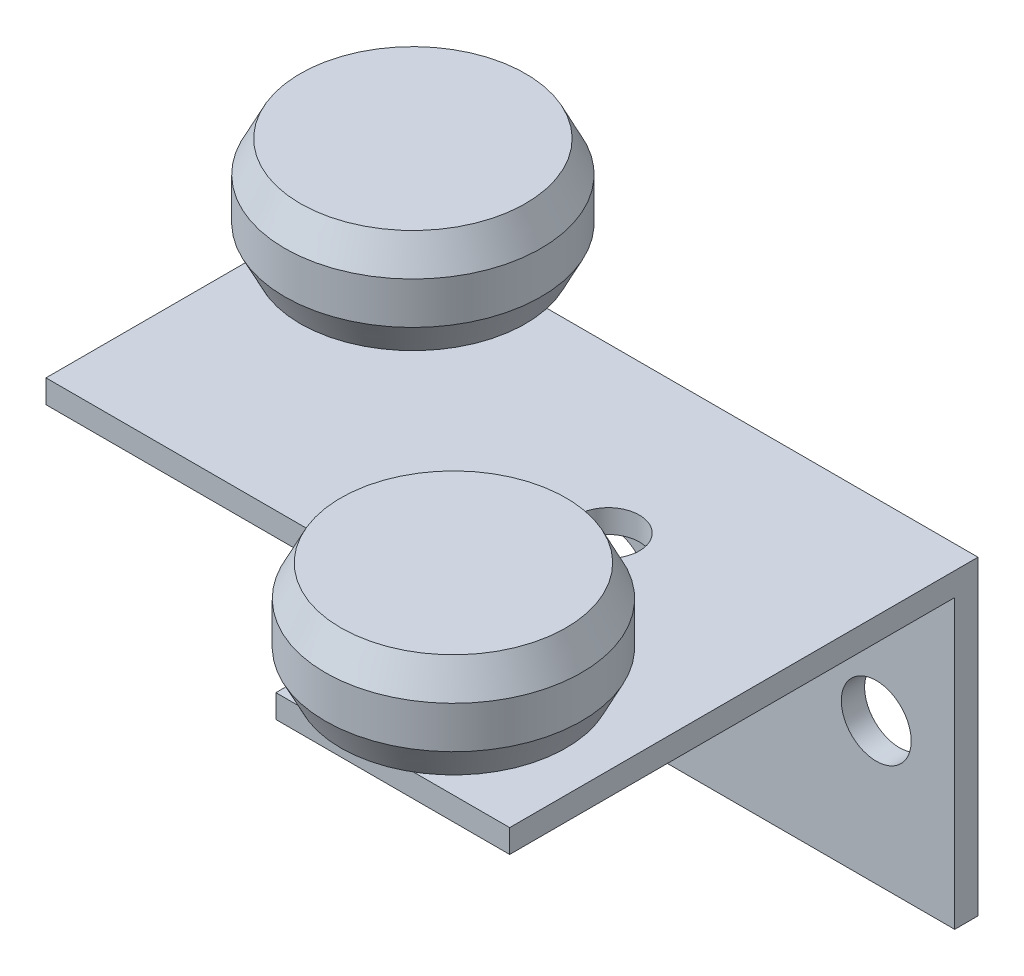
ISO-10303-21;
HEADER;
FILE_DESCRIPTION(('STEP AP214'),'2;1');
FILE_NAME('part.step','',(''),(''),'','','');
FILE_SCHEMA(('AUTOMOTIVE_DESIGN { 1 0 10303 214 1 1 1 1 }'));
ENDSEC;
DATA;
#1=APPLICATION_CONTEXT('core data for automotive mechanical design processes');
#2=APPLICATION_PROTOCOL_DEFINITION('international standard','automotive_design',2000,#1);
#3=PRODUCT_CONTEXT('',#1,'mechanical');
#4=PRODUCT('Part','Part','',(#3));
#5=PRODUCT_RELATED_PRODUCT_CATEGORY('part','',(#4));
#6=PRODUCT_DEFINITION_FORMATION('','',#4);
#7=PRODUCT_DEFINITION_CONTEXT('part definition',#1,'design');
#8=PRODUCT_DEFINITION('design','',#6,#7);
#9=PRODUCT_DEFINITION_SHAPE('','',#8);
#10=(LENGTH_UNIT() NAMED_UNIT(*) SI_UNIT(.MILLI.,.METRE.));
#11=(NAMED_UNIT(*) PLANE_ANGLE_UNIT() SI_UNIT($,.RADIAN.));
#12=(NAMED_UNIT(*) SI_UNIT($,.STERADIAN.) SOLID_ANGLE_UNIT());
#13=UNCERTAINTY_MEASURE_WITH_UNIT(LENGTH_MEASURE(1.E-05),#10,'distance_accuracy_value','');
#14=(GEOMETRIC_REPRESENTATION_CONTEXT(3) GLOBAL_UNCERTAINTY_ASSIGNED_CONTEXT((#13)) GLOBAL_UNIT_ASSIGNED_CONTEXT((#10,
#11,#12)) REPRESENTATION_CONTEXT('',''));
#15=CARTESIAN_POINT('',(0.,0.,0.));
#16=DIRECTION('',(0.,0.,1.));
#17=DIRECTION('',(1.,0.,0.));
#18=AXIS2_PLACEMENT_3D('',#15,#16,#17);
#19=CARTESIAN_POINT('',(-313.663037827401,-412.414988452452,26.25));
#20=DIRECTION('',(0.,-1.,0.));
#21=DIRECTION('',(0.,0.,-1.));
#22=AXIS2_PLACEMENT_3D('',#19,#20,#21);
#23=CYLINDRICAL_SURFACE('',#22,1.69999999999996);
#24=CARTESIAN_POINT('',(-313.663037827401,-421.464988452452,26.25));
#25=DIRECTION('',(0.,-1.,0.));
#26=DIRECTION('',(0.,0.,-1.));
#27=AXIS2_PLACEMENT_3D('',#24,#25,#26);
#28=CIRCLE('',#27,1.69999999999996);
#29=CARTESIAN_POINT('',(-313.663037827401,-421.464988452452,24.55));
#30=VERTEX_POINT('',#29);
#31=EDGE_CURVE('E216',#30,#30,#28,.F.);
#32=ORIENTED_EDGE('',*,*,#31,.T.);
#33=EDGE_LOOP('',(#32));
#34=FACE_BOUND('',#33,.T.);
#35=CARTESIAN_POINT('',(-313.663037827401,-419.114988452452,26.25));
#36=DIRECTION('',(0.,1.,0.));
#37=DIRECTION('',(0.,0.,1.));
#38=AXIS2_PLACEMENT_3D('',#35,#36,#37);
#39=CIRCLE('',#38,1.69999999999996);
#40=CARTESIAN_POINT('',(-313.663037827401,-419.114988452452,27.95));
#41=VERTEX_POINT('',#40);
#42=EDGE_CURVE('E227',#41,#41,#39,.T.);
#43=ORIENTED_EDGE('',*,*,#42,.F.);
#44=EDGE_LOOP('',(#43));
#45=FACE_BOUND('',#44,.T.);
#46=ADVANCED_FACE('F16',(#34,#45),#23,.T.);
#47=CARTESIAN_POINT('',(-338.623037827401,-412.414988452452,3.9));
#48=DIRECTION('',(0.,-1.,0.));
#49=DIRECTION('',(0.,0.,-1.));
#50=AXIS2_PLACEMENT_3D('',#47,#48,#49);
#51=CYLINDRICAL_SURFACE('',#50,1.69999999999996);
#52=CARTESIAN_POINT('',(-338.623037827401,-421.464988452452,3.9));
#53=DIRECTION('',(0.,-1.,0.));
#54=DIRECTION('',(0.,0.,-1.));
#55=AXIS2_PLACEMENT_3D('',#52,#53,#54);
#56=CIRCLE('',#55,1.69999999999996);
#57=CARTESIAN_POINT('',(-338.623037827401,-421.464988452452,2.20000000000004));
#58=VERTEX_POINT('',#57);
#59=EDGE_CURVE('E219',#58,#58,#56,.F.);
#60=ORIENTED_EDGE('',*,*,#59,.T.);
#61=EDGE_LOOP('',(#60));
#62=FACE_BOUND('',#61,.T.);
#63=CARTESIAN_POINT('',(-338.623037827401,-419.114988452452,3.9));
#64=DIRECTION('',(0.,1.,0.));
#65=DIRECTION('',(0.,0.,1.));
#66=AXIS2_PLACEMENT_3D('',#63,#64,#65);
#67=CIRCLE('',#66,1.69999999999996);
#68=CARTESIAN_POINT('',(-338.623037827401,-419.114988452452,5.59999999999996));
#69=VERTEX_POINT('',#68);
#70=EDGE_CURVE('E223',#69,#69,#67,.T.);
#71=ORIENTED_EDGE('',*,*,#70,.F.);
#72=EDGE_LOOP('',(#71));
#73=FACE_BOUND('',#72,.T.);
#74=ADVANCED_FACE('F274',(#62,#73),#51,.T.);
#75=CARTESIAN_POINT('',(-333.243037827401,-421.464988452452,1.5));
#76=DIRECTION('',(0.,-1.,0.));
#77=DIRECTION('',(0.,0.,-1.));
#78=AXIS2_PLACEMENT_3D('',#75,#76,#77);
#79=PLANE('',#78);
#80=ORIENTED_EDGE('',*,*,#31,.F.);
#81=EDGE_LOOP('',(#80));
#82=FACE_BOUND('',#81,.T.);
#83=DIRECTION('',(-1.,0.,0.));
#84=VECTOR('',#83,1.);
#85=CARTESIAN_POINT('',(-333.243037827401,-421.464988452452,0.));
#86=LINE('',#85,#84);
#87=CARTESIAN_POINT('',(-306.143037827401,-421.464988452452,0.));
#88=VERTEX_POINT('',#87);
#89=CARTESIAN_POINT('',(-346.143037827401,-421.464988452452,0.));
#90=VERTEX_POINT('',#89);
#91=EDGE_CURVE('E186',#88,#90,#86,.T.);
#92=ORIENTED_EDGE('',*,*,#91,.T.);
#93=DIRECTION('',(0.,0.,1.));
#94=VECTOR('',#93,1.);
#95=CARTESIAN_POINT('',(-346.143037827401,-421.464988452452,20.));
#96=LINE('',#95,#94);
#97=CARTESIAN_POINT('',(-346.143037827401,-421.464988452452,20.));
#98=VERTEX_POINT('',#97);
#99=EDGE_CURVE('E126',#90,#98,#96,.T.);
#100=ORIENTED_EDGE('',*,*,#99,.T.);
#101=DIRECTION('',(1.,0.,0.));
#102=VECTOR('',#101,1.);
#103=CARTESIAN_POINT('',(-321.193037827401,-421.464988452452,20.));
#104=LINE('',#103,#102);
#105=CARTESIAN_POINT('',(-321.193037827401,-421.464988452452,20.));
#106=VERTEX_POINT('',#105);
#107=EDGE_CURVE('E122',#98,#106,#104,.T.);
#108=ORIENTED_EDGE('',*,*,#107,.T.);
#109=DIRECTION('',(0.,0.,1.));
#110=VECTOR('',#109,1.);
#111=CARTESIAN_POINT('',(-321.193037827401,-421.464988452452,30.15));
#112=LINE('',#111,#110);
#113=CARTESIAN_POINT('',(-321.193037827401,-421.464988452452,30.15));
#114=VERTEX_POINT('',#113);
#115=EDGE_CURVE('E142',#106,#114,#112,.T.);
#116=ORIENTED_EDGE('',*,*,#115,.T.);
#117=DIRECTION('',(1.,0.,0.));
#118=VECTOR('',#117,1.);
#119=CARTESIAN_POINT('',(-306.143037827401,-421.464988452452,30.15));
#120=LINE('',#119,#118);
#121=CARTESIAN_POINT('',(-306.143037827401,-421.464988452452,30.15));
#122=VERTEX_POINT('',#121);
#123=EDGE_CURVE('E100',#114,#122,#120,.T.);
#124=ORIENTED_EDGE('',*,*,#123,.T.);
#125=DIRECTION('',(0.,0.,-1.));
#126=VECTOR('',#125,1.);
#127=CARTESIAN_POINT('',(-306.143037827401,-421.464988452452,1.5));
#128=LINE('',#127,#126);
#129=EDGE_CURVE('E190',#122,#88,#128,.T.);
#130=ORIENTED_EDGE('',*,*,#129,.T.);
#131=EDGE_LOOP('',(#92,#100,#108,#116,#124,#130));
#132=FACE_BOUND('',#131,.T.);
#133=CARTESIAN_POINT('',(-319.393037827401,-421.464988452452,10.55));
#134=DIRECTION('',(0.,1.,0.));
#135=DIRECTION('',(0.,0.,1.));
#136=AXIS2_PLACEMENT_3D('',#133,#134,#135);
#137=CIRCLE('',#136,2.);
#138=CARTESIAN_POINT('',(-319.393037827401,-421.464988452452,12.55));
#139=VERTEX_POINT('',#138);
#140=EDGE_CURVE('E129',#139,#139,#137,.T.);
#141=ORIENTED_EDGE('',*,*,#140,.F.);
#142=EDGE_LOOP('',(#141));
#143=FACE_BOUND('',#142,.T.);
#144=ORIENTED_EDGE('',*,*,#59,.F.);
#145=EDGE_LOOP('',(#144));
#146=FACE_BOUND('',#145,.T.);
#147=ADVANCED_FACE('F281',(#82,#132,#143,#146),#79,.F.);
#148=CARTESIAN_POINT('',(0.,-422.964988452452,0.));
#149=DIRECTION('',(0.,1.,0.));
#150=DIRECTION('',(0.,0.,1.));
#151=AXIS2_PLACEMENT_3D('',#148,#149,#150);
#152=PLANE('',#151);
#153=CARTESIAN_POINT('',(-313.673037827401,-422.964988452452,26.25));
#154=DIRECTION('',(0.,1.,0.));
#155=DIRECTION('',(0.,0.,1.));
#156=AXIS2_PLACEMENT_3D('',#153,#154,#155);
#157=CIRCLE('',#156,3.30000000000003);
#158=CARTESIAN_POINT('',(-313.673037827401,-422.964988452452,29.55));
#159=VERTEX_POINT('',#158);
#160=EDGE_CURVE('E209',#159,#159,#157,.F.);
#161=ORIENTED_EDGE('',*,*,#160,.F.);
#162=EDGE_LOOP('',(#161));
#163=FACE_BOUND('',#162,.T.);
#164=CARTESIAN_POINT('',(-319.393037827401,-422.964988452452,10.55));
#165=DIRECTION('',(0.,1.,0.));
#166=DIRECTION('',(0.,0.,1.));
#167=AXIS2_PLACEMENT_3D('',#164,#165,#166);
#168=CIRCLE('',#167,2.);
#169=CARTESIAN_POINT('',(-319.393037827401,-422.964988452452,12.55));
#170=VERTEX_POINT('',#169);
#171=EDGE_CURVE('E145',#170,#170,#168,.T.);
#172=ORIENTED_EDGE('',*,*,#171,.T.);
#173=EDGE_LOOP('',(#172));
#174=FACE_BOUND('',#173,.T.);
#175=DIRECTION('',(-1.,0.,0.));
#176=VECTOR('',#175,1.);
#177=CARTESIAN_POINT('',(-306.143037827401,-422.964988452452,0.));
#178=LINE('',#177,#176);
#179=CARTESIAN_POINT('',(-333.243037827401,-422.964988452452,0.));
#180=VERTEX_POINT('',#179);
#181=CARTESIAN_POINT('',(-346.143037827401,-422.964988452452,0.));
#182=VERTEX_POINT('',#181);
#183=EDGE_CURVE('E134',#180,#182,#178,.T.);
#184=ORIENTED_EDGE('',*,*,#183,.F.);
#185=DIRECTION('',(0.,0.,1.));
#186=VECTOR('',#185,1.);
#187=CARTESIAN_POINT('',(-333.243037827401,-422.964988452452,1.5));
#188=LINE('',#187,#186);
#189=CARTESIAN_POINT('',(-333.243037827401,-422.964988452452,1.5));
#190=VERTEX_POINT('',#189);
#191=EDGE_CURVE('E161',#180,#190,#188,.T.);
#192=ORIENTED_EDGE('',*,*,#191,.T.);
#193=DIRECTION('',(-1.,0.,0.));
#194=VECTOR('',#193,1.);
#195=CARTESIAN_POINT('',(0.,-422.964988452452,1.5));
#196=LINE('',#195,#194);
#197=CARTESIAN_POINT('',(-306.143037827401,-422.964988452452,1.5));
#198=VERTEX_POINT('',#197);
#199=EDGE_CURVE('E41',#198,#190,#196,.T.);
#200=ORIENTED_EDGE('',*,*,#199,.F.);
#201=DIRECTION('',(0.,0.,-1.));
#202=VECTOR('',#201,1.);
#203=CARTESIAN_POINT('',(-306.143037827401,-422.964988452452,0.));
#204=LINE('',#203,#202);
#205=CARTESIAN_POINT('',(-306.143037827401,-422.964988452452,30.15));
#206=VERTEX_POINT('',#205);
#207=EDGE_CURVE('E118',#206,#198,#204,.T.);
#208=ORIENTED_EDGE('',*,*,#207,.F.);
#209=DIRECTION('',(1.,0.,0.));
#210=VECTOR('',#209,1.);
#211=CARTESIAN_POINT('',(-306.143037827401,-422.964988452452,30.15));
#212=LINE('',#211,#210);
#213=CARTESIAN_POINT('',(-321.193037827401,-422.964988452452,30.15));
#214=VERTEX_POINT('',#213);
#215=EDGE_CURVE('E98',#214,#206,#212,.T.);
#216=ORIENTED_EDGE('',*,*,#215,.F.);
#217=DIRECTION('',(0.,0.,1.));
#218=VECTOR('',#217,1.);
#219=CARTESIAN_POINT('',(-321.193037827401,-422.964988452452,30.15));
#220=LINE('',#219,#218);
#221=CARTESIAN_POINT('',(-321.193037827401,-422.964988452452,20.));
#222=VERTEX_POINT('',#221);
#223=EDGE_CURVE('E115',#222,#214,#220,.T.);
#224=ORIENTED_EDGE('',*,*,#223,.F.);
#225=DIRECTION('',(1.,0.,0.));
#226=VECTOR('',#225,1.);
#227=CARTESIAN_POINT('',(-321.193037827401,-422.964988452452,20.));
#228=LINE('',#227,#226);
#229=CARTESIAN_POINT('',(-346.143037827401,-422.964988452452,20.));
#230=VERTEX_POINT('',#229);
#231=EDGE_CURVE('E106',#230,#222,#228,.T.);
#232=ORIENTED_EDGE('',*,*,#231,.F.);
#233=DIRECTION('',(0.,0.,1.));
#234=VECTOR('',#233,1.);
#235=CARTESIAN_POINT('',(-346.143037827401,-422.964988452452,20.));
#236=LINE('',#235,#234);
#237=EDGE_CURVE('E137',#182,#230,#236,.T.);
#238=ORIENTED_EDGE('',*,*,#237,.F.);
#239=EDGE_LOOP('',(#184,#192,#200,#208,#216,#224,#232,#238));
#240=FACE_BOUND('',#239,.T.);
#241=CARTESIAN_POINT('',(-338.623037827401,-422.964988452452,3.9));
#242=DIRECTION('',(0.,1.,0.));
#243=DIRECTION('',(0.,0.,1.));
#244=AXIS2_PLACEMENT_3D('',#241,#242,#243);
#245=CIRCLE('',#244,3.30000000000003);
#246=CARTESIAN_POINT('',(-338.623037827401,-422.964988452452,7.20000000000003));
#247=VERTEX_POINT('',#246);
#248=EDGE_CURVE('E212',#247,#247,#245,.F.);
#249=ORIENTED_EDGE('',*,*,#248,.F.);
#250=EDGE_LOOP('',(#249));
#251=FACE_BOUND('',#250,.T.);
#252=ADVANCED_FACE('F112',(#163,#174,#240,#251),#152,.F.);
#253=CARTESIAN_POINT('',(-333.243037827401,-421.464988452452,1.5));
#254=DIRECTION('',(1.,0.,0.));
#255=DIRECTION('',(0.,0.,-1.));
#256=AXIS2_PLACEMENT_3D('',#253,#254,#255);
#257=PLANE('',#256);
#258=ORIENTED_EDGE('',*,*,#191,.F.);
#259=DIRECTION('',(0.,-1.,0.));
#260=VECTOR('',#259,1.);
#261=CARTESIAN_POINT('',(-333.243037827401,-421.464988452452,0.));
#262=LINE('',#261,#260);
#263=CARTESIAN_POINT('',(-333.243037827401,-441.464988452452,0.));
#264=VERTEX_POINT('',#263);
#265=EDGE_CURVE('E178',#180,#264,#262,.T.);
#266=ORIENTED_EDGE('',*,*,#265,.T.);
#267=DIRECTION('',(0.,0.,-1.));
#268=VECTOR('',#267,1.);
#269=CARTESIAN_POINT('',(-333.243037827401,-441.464988452452,1.5));
#270=LINE('',#269,#268);
#271=CARTESIAN_POINT('',(-333.243037827401,-441.464988452452,1.5));
#272=VERTEX_POINT('',#271);
#273=EDGE_CURVE('E206',#272,#264,#270,.T.);
#274=ORIENTED_EDGE('',*,*,#273,.F.);
#275=DIRECTION('',(0.,-1.,0.));
#276=VECTOR('',#275,1.);
#277=CARTESIAN_POINT('',(-333.243037827401,-421.464988452452,1.5));
#278=LINE('',#277,#276);
#279=EDGE_CURVE('E182',#190,#272,#278,.T.);
#280=ORIENTED_EDGE('',*,*,#279,.F.);
#281=EDGE_LOOP('',(#258,#266,#274,#280));
#282=FACE_BOUND('',#281,.T.);
#283=ADVANCED_FACE('F311',(#282),#257,.F.);
#284=CARTESIAN_POINT('',(0.,0.,1.5));
#285=DIRECTION('',(0.,0.,1.));
#286=DIRECTION('',(1.,0.,0.));
#287=AXIS2_PLACEMENT_3D('',#284,#285,#286);
#288=PLANE('',#287);
#289=CARTESIAN_POINT('',(-311.193037827401,-432.364988452452,1.5));
#290=DIRECTION('',(0.,0.,1.));
#291=DIRECTION('',(1.,0.,0.));
#292=AXIS2_PLACEMENT_3D('',#289,#290,#291);
#293=CIRCLE('',#292,2.24999999999995);
#294=CARTESIAN_POINT('',(-308.943037827401,-432.364988452452,1.5));
#295=VERTEX_POINT('',#294);
#296=EDGE_CURVE('E170',#295,#295,#293,.T.);
#297=ORIENTED_EDGE('',*,*,#296,.F.);
#298=EDGE_LOOP('',(#297));
#299=FACE_BOUND('',#298,.T.);
#300=CARTESIAN_POINT('',(-328.193037827401,-432.364988452452,1.5));
#301=DIRECTION('',(0.,0.,1.));
#302=DIRECTION('',(1.,0.,0.));
#303=AXIS2_PLACEMENT_3D('',#300,#301,#302);
#304=CIRCLE('',#303,2.24999999999995);
#305=CARTESIAN_POINT('',(-325.943037827401,-432.364988452452,1.5));
#306=VERTEX_POINT('',#305);
#307=EDGE_CURVE('E165',#306,#306,#304,.T.);
#308=ORIENTED_EDGE('',*,*,#307,.F.);
#309=EDGE_LOOP('',(#308));
#310=FACE_BOUND('',#309,.T.);
#311=DIRECTION('',(0.,1.,0.));
#312=VECTOR('',#311,1.);
#313=CARTESIAN_POINT('',(-306.143037827401,-421.464988452452,1.5));
#314=LINE('',#313,#312);
#315=CARTESIAN_POINT('',(-306.143037827401,-441.464988452452,1.5));
#316=VERTEX_POINT('',#315);
#317=EDGE_CURVE('E36',#316,#198,#314,.T.);
#318=ORIENTED_EDGE('',*,*,#317,.T.);
#319=ORIENTED_EDGE('',*,*,#199,.T.);
#320=ORIENTED_EDGE('',*,*,#279,.T.);
#321=DIRECTION('',(1.,0.,0.));
#322=VECTOR('',#321,1.);
#323=CARTESIAN_POINT('',(-333.243037827401,-441.464988452452,1.5));
#324=LINE('',#323,#322);
#325=EDGE_CURVE('E185',#272,#316,#324,.T.);
#326=ORIENTED_EDGE('',*,*,#325,.T.);
#327=EDGE_LOOP('',(#318,#319,#320,#326));
#328=FACE_BOUND('',#327,.T.);
#329=ADVANCED_FACE('F334',(#299,#310,#328),#288,.T.);
#330=CARTESIAN_POINT('',(-333.243037827401,-441.464988452452,1.5));
#331=DIRECTION('',(0.,1.,0.));
#332=DIRECTION('',(0.,0.,1.));
#333=AXIS2_PLACEMENT_3D('',#330,#331,#332);
#334=PLANE('',#333);
#335=DIRECTION('',(1.,0.,0.));
#336=VECTOR('',#335,1.);
#337=CARTESIAN_POINT('',(-333.243037827401,-441.464988452452,0.));
#338=LINE('',#337,#336);
#339=CARTESIAN_POINT('',(-306.143037827401,-441.464988452452,0.));
#340=VERTEX_POINT('',#339);
#341=EDGE_CURVE('E193',#264,#340,#338,.T.);
#342=ORIENTED_EDGE('',*,*,#341,.T.);
#343=DIRECTION('',(0.,0.,-1.));
#344=VECTOR('',#343,1.);
#345=CARTESIAN_POINT('',(-306.143037827401,-441.464988452452,1.5));
#346=LINE('',#345,#344);
#347=EDGE_CURVE('E203',#316,#340,#346,.T.);
#348=ORIENTED_EDGE('',*,*,#347,.F.);
#349=ORIENTED_EDGE('',*,*,#325,.F.);
#350=ORIENTED_EDGE('',*,*,#273,.T.);
#351=EDGE_LOOP('',(#342,#348,#349,#350));
#352=FACE_BOUND('',#351,.T.);
#353=ADVANCED_FACE('F337',(#352),#334,.F.);
#354=CARTESIAN_POINT('',(-306.143037827401,-421.464988452452,1.5));
#355=DIRECTION('',(-1.,0.,0.));
#356=DIRECTION('',(0.,0.,1.));
#357=AXIS2_PLACEMENT_3D('',#354,#355,#356);
#358=PLANE('',#357);
#359=ORIENTED_EDGE('',*,*,#129,.F.);
#360=DIRECTION('',(0.,1.,0.));
#361=VECTOR('',#360,1.);
#362=CARTESIAN_POINT('',(-306.143037827401,-422.964988452452,30.15));
#363=LINE('',#362,#361);
#364=EDGE_CURVE('E105',#206,#122,#363,.T.);
#365=ORIENTED_EDGE('',*,*,#364,.F.);
#366=ORIENTED_EDGE('',*,*,#207,.T.);
#367=ORIENTED_EDGE('',*,*,#317,.F.);
#368=ORIENTED_EDGE('',*,*,#347,.T.);
#369=DIRECTION('',(0.,1.,0.));
#370=VECTOR('',#369,1.);
#371=CARTESIAN_POINT('',(-306.143037827401,-421.464988452452,0.));
#372=LINE('',#371,#370);
#373=EDGE_CURVE('E195',#340,#88,#372,.T.);
#374=ORIENTED_EDGE('',*,*,#373,.T.);
#375=EDGE_LOOP('',(#359,#365,#366,#367,#368,#374));
#376=FACE_BOUND('',#375,.T.);
#377=ADVANCED_FACE('F341',(#376),#358,.F.);
#378=CARTESIAN_POINT('',(0.,0.,0.));
#379=DIRECTION('',(0.,0.,1.));
#380=DIRECTION('',(1.,0.,0.));
#381=AXIS2_PLACEMENT_3D('',#378,#379,#380);
#382=PLANE('',#381);
#383=ORIENTED_EDGE('',*,*,#91,.F.);
#384=ORIENTED_EDGE('',*,*,#373,.F.);
#385=ORIENTED_EDGE('',*,*,#341,.F.);
#386=ORIENTED_EDGE('',*,*,#265,.F.);
#387=ORIENTED_EDGE('',*,*,#183,.T.);
#388=DIRECTION('',(0.,1.,0.));
#389=VECTOR('',#388,1.);
#390=CARTESIAN_POINT('',(-346.143037827401,-422.964988452452,0.));
#391=LINE('',#390,#389);
#392=EDGE_CURVE('E154',#182,#90,#391,.T.);
#393=ORIENTED_EDGE('',*,*,#392,.T.);
#394=EDGE_LOOP('',(#383,#384,#385,#386,#387,#393));
#395=FACE_BOUND('',#394,.T.);
#396=CARTESIAN_POINT('',(-311.193037827401,-432.364988452452,0.));
#397=DIRECTION('',(0.,0.,1.));
#398=DIRECTION('',(1.,0.,0.));
#399=AXIS2_PLACEMENT_3D('',#396,#397,#398);
#400=CIRCLE('',#399,2.24999999999995);
#401=CARTESIAN_POINT('',(-308.943037827401,-432.364988452452,0.));
#402=VERTEX_POINT('',#401);
#403=EDGE_CURVE('E174',#402,#402,#400,.T.);
#404=ORIENTED_EDGE('',*,*,#403,.T.);
#405=EDGE_LOOP('',(#404));
#406=FACE_BOUND('',#405,.T.);
#407=CARTESIAN_POINT('',(-328.193037827401,-432.364988452452,0.));
#408=DIRECTION('',(0.,0.,1.));
#409=DIRECTION('',(1.,0.,0.));
#410=AXIS2_PLACEMENT_3D('',#407,#408,#409);
#411=CIRCLE('',#410,2.24999999999995);
#412=CARTESIAN_POINT('',(-325.943037827401,-432.364988452452,0.));
#413=VERTEX_POINT('',#412);
#414=EDGE_CURVE('E166',#413,#413,#411,.T.);
#415=ORIENTED_EDGE('',*,*,#414,.T.);
#416=EDGE_LOOP('',(#415));
#417=FACE_BOUND('',#416,.T.);
#418=ADVANCED_FACE('F332',(#395,#406,#417),#382,.F.);
#419=CARTESIAN_POINT('',(-311.193037827401,-432.364988452452,0.));
#420=DIRECTION('',(0.,0.,1.));
#421=DIRECTION('',(1.,0.,0.));
#422=AXIS2_PLACEMENT_3D('',#419,#420,#421);
#423=CYLINDRICAL_SURFACE('',#422,2.24999999999995);
#424=ORIENTED_EDGE('',*,*,#403,.F.);
#425=EDGE_LOOP('',(#424));
#426=FACE_BOUND('',#425,.T.);
#427=ORIENTED_EDGE('',*,*,#296,.T.);
#428=EDGE_LOOP('',(#427));
#429=FACE_BOUND('',#428,.T.);
#430=ADVANCED_FACE('F328',(#426,#429),#423,.F.);
#431=CARTESIAN_POINT('',(-328.193037827401,-432.364988452452,0.));
#432=DIRECTION('',(0.,0.,1.));
#433=DIRECTION('',(1.,0.,0.));
#434=AXIS2_PLACEMENT_3D('',#431,#432,#433);
#435=CYLINDRICAL_SURFACE('',#434,2.24999999999995);
#436=ORIENTED_EDGE('',*,*,#414,.F.);
#437=EDGE_LOOP('',(#436));
#438=FACE_BOUND('',#437,.T.);
#439=ORIENTED_EDGE('',*,*,#307,.T.);
#440=EDGE_LOOP('',(#439));
#441=FACE_BOUND('',#440,.T.);
#442=ADVANCED_FACE('F325',(#438,#441),#435,.F.);
#443=CARTESIAN_POINT('',(-321.193037827401,-422.964988452452,30.15));
#444=DIRECTION('',(-1.,0.,0.));
#445=DIRECTION('',(0.,0.,1.));
#446=AXIS2_PLACEMENT_3D('',#443,#444,#445);
#447=PLANE('',#446);
#448=ORIENTED_EDGE('',*,*,#115,.F.);
#449=DIRECTION('',(0.,1.,0.));
#450=VECTOR('',#449,1.);
#451=CARTESIAN_POINT('',(-321.193037827401,-422.964988452452,20.));
#452=LINE('',#451,#450);
#453=EDGE_CURVE('E121',#222,#106,#452,.T.);
#454=ORIENTED_EDGE('',*,*,#453,.F.);
#455=ORIENTED_EDGE('',*,*,#223,.T.);
#456=DIRECTION('',(0.,1.,0.));
#457=VECTOR('',#456,1.);
#458=CARTESIAN_POINT('',(-321.193037827401,-422.964988452452,30.15));
#459=LINE('',#458,#457);
#460=EDGE_CURVE('E94',#214,#114,#459,.T.);
#461=ORIENTED_EDGE('',*,*,#460,.T.);
#462=EDGE_LOOP('',(#448,#454,#455,#461));
#463=FACE_BOUND('',#462,.T.);
#464=ADVANCED_FACE('F120',(#463),#447,.T.);
#465=CARTESIAN_POINT('',(-321.193037827401,-422.964988452452,20.));
#466=DIRECTION('',(0.,0.,1.));
#467=DIRECTION('',(1.,0.,0.));
#468=AXIS2_PLACEMENT_3D('',#465,#466,#467);
#469=PLANE('',#468);
#470=ORIENTED_EDGE('',*,*,#107,.F.);
#471=DIRECTION('',(0.,1.,0.));
#472=VECTOR('',#471,1.);
#473=CARTESIAN_POINT('',(-346.143037827401,-422.964988452452,20.));
#474=LINE('',#473,#472);
#475=EDGE_CURVE('E152',#230,#98,#474,.T.);
#476=ORIENTED_EDGE('',*,*,#475,.F.);
#477=ORIENTED_EDGE('',*,*,#231,.T.);
#478=ORIENTED_EDGE('',*,*,#453,.T.);
#479=EDGE_LOOP('',(#470,#476,#477,#478));
#480=FACE_BOUND('',#479,.T.);
#481=ADVANCED_FACE('F313',(#480),#469,.T.);
#482=CARTESIAN_POINT('',(-346.143037827401,-422.964988452452,20.));
#483=DIRECTION('',(-1.,0.,0.));
#484=DIRECTION('',(0.,0.,1.));
#485=AXIS2_PLACEMENT_3D('',#482,#483,#484);
#486=PLANE('',#485);
#487=ORIENTED_EDGE('',*,*,#99,.F.);
#488=ORIENTED_EDGE('',*,*,#392,.F.);
#489=ORIENTED_EDGE('',*,*,#237,.T.);
#490=ORIENTED_EDGE('',*,*,#475,.T.);
#491=EDGE_LOOP('',(#487,#488,#489,#490));
#492=FACE_BOUND('',#491,.T.);
#493=ADVANCED_FACE('F316',(#492),#486,.T.);
#494=CARTESIAN_POINT('',(-306.143037827401,-422.964988452452,30.15));
#495=DIRECTION('',(0.,0.,1.));
#496=DIRECTION('',(1.,0.,0.));
#497=AXIS2_PLACEMENT_3D('',#494,#495,#496);
#498=PLANE('',#497);
#499=ORIENTED_EDGE('',*,*,#123,.F.);
#500=ORIENTED_EDGE('',*,*,#460,.F.);
#501=ORIENTED_EDGE('',*,*,#215,.T.);
#502=ORIENTED_EDGE('',*,*,#364,.T.);
#503=EDGE_LOOP('',(#499,#500,#501,#502));
#504=FACE_BOUND('',#503,.T.);
#505=ADVANCED_FACE('F96',(#504),#498,.T.);
#506=CARTESIAN_POINT('',(-319.393037827401,-422.964988452452,10.55));
#507=DIRECTION('',(0.,1.,0.));
#508=DIRECTION('',(0.,0.,1.));
#509=AXIS2_PLACEMENT_3D('',#506,#507,#508);
#510=CYLINDRICAL_SURFACE('',#509,2.);
#511=ORIENTED_EDGE('',*,*,#171,.F.);
#512=EDGE_LOOP('',(#511));
#513=FACE_BOUND('',#512,.T.);
#514=ORIENTED_EDGE('',*,*,#140,.T.);
#515=EDGE_LOOP('',(#514));
#516=FACE_BOUND('',#515,.T.);
#517=ADVANCED_FACE('F304',(#513,#516),#510,.F.);
#518=CARTESIAN_POINT('',(-313.673037827401,-423.564988452452,26.25));
#519=DIRECTION('',(0.,1.,0.));
#520=DIRECTION('',(0.,0.,1.));
#521=AXIS2_PLACEMENT_3D('',#518,#519,#520);
#522=CYLINDRICAL_SURFACE('',#521,3.30000000000003);
#523=CARTESIAN_POINT('',(-313.673037827401,-423.564988452452,26.25));
#524=DIRECTION('',(0.,-1.,0.));
#525=DIRECTION('',(0.,0.,-1.));
#526=AXIS2_PLACEMENT_3D('',#523,#524,#525);
#527=CIRCLE('',#526,3.30000000000003);
#528=CARTESIAN_POINT('',(-313.673037827401,-423.564988452452,22.95));
#529=VERTEX_POINT('',#528);
#530=EDGE_CURVE('E539',#529,#529,#527,.T.);
#531=ORIENTED_EDGE('',*,*,#530,.F.);
#532=EDGE_LOOP('',(#531));
#533=FACE_BOUND('',#532,.T.);
#534=ORIENTED_EDGE('',*,*,#160,.T.);
#535=EDGE_LOOP('',(#534));
#536=FACE_BOUND('',#535,.T.);
#537=ADVANCED_FACE('F300',(#533,#536),#522,.T.);
#538=CARTESIAN_POINT('',(-313.673037827401,-423.564988452452,26.25));
#539=DIRECTION('',(0.,-1.,0.));
#540=DIRECTION('',(0.,0.,-1.));
#541=AXIS2_PLACEMENT_3D('',#538,#539,#540);
#542=PLANE('',#541);
#543=ORIENTED_EDGE('',*,*,#530,.T.);
#544=EDGE_LOOP('',(#543));
#545=FACE_BOUND('',#544,.T.);
#546=ADVANCED_FACE('F296',(#545),#542,.T.);
#547=CARTESIAN_POINT('',(-338.623037827401,-423.564988452452,3.9));
#548=DIRECTION('',(0.,1.,0.));
#549=DIRECTION('',(0.,0.,1.));
#550=AXIS2_PLACEMENT_3D('',#547,#548,#549);
#551=CYLINDRICAL_SURFACE('',#550,3.30000000000003);
#552=CARTESIAN_POINT('',(-338.623037827401,-423.564988452452,3.9));
#553=DIRECTION('',(0.,-1.,0.));
#554=DIRECTION('',(0.,0.,-1.));
#555=AXIS2_PLACEMENT_3D('',#552,#553,#554);
#556=CIRCLE('',#555,3.30000000000003);
#557=CARTESIAN_POINT('',(-338.623037827401,-423.564988452452,0.599999999999965));
#558=VERTEX_POINT('',#557);
#559=EDGE_CURVE('E543',#558,#558,#556,.T.);
#560=ORIENTED_EDGE('',*,*,#559,.F.);
#561=EDGE_LOOP('',(#560));
#562=FACE_BOUND('',#561,.T.);
#563=ORIENTED_EDGE('',*,*,#248,.T.);
#564=EDGE_LOOP('',(#563));
#565=FACE_BOUND('',#564,.T.);
#566=ADVANCED_FACE('F292',(#562,#565),#551,.T.);
#567=CARTESIAN_POINT('',(-338.623037827401,-423.564988452452,3.9));
#568=DIRECTION('',(0.,-1.,0.));
#569=DIRECTION('',(0.,0.,-1.));
#570=AXIS2_PLACEMENT_3D('',#567,#568,#569);
#571=PLANE('',#570);
#572=ORIENTED_EDGE('',*,*,#559,.T.);
#573=EDGE_LOOP('',(#572));
#574=FACE_BOUND('',#573,.T.);
#575=ADVANCED_FACE('F288',(#574),#571,.T.);
#576=CARTESIAN_POINT('',(-338.623037827401,-419.114988452452,3.9));
#577=DIRECTION('',(0.,1.,0.));
#578=DIRECTION('',(0.,0.,1.));
#579=AXIS2_PLACEMENT_3D('',#576,#577,#578);
#580=PLANE('',#579);
#581=CARTESIAN_POINT('',(-338.623037827401,-419.114988452452,3.9));
#582=DIRECTION('',(0.,1.,0.));
#583=DIRECTION('',(0.,0.,1.));
#584=AXIS2_PLACEMENT_3D('',#581,#582,#583);
#585=CIRCLE('',#584,7.25);
#586=CARTESIAN_POINT('',(-338.623037827401,-419.114988452452,11.15));
#587=VERTEX_POINT('',#586);
#588=EDGE_CURVE('E11',#587,#587,#585,.F.);
#589=ORIENTED_EDGE('',*,*,#588,.T.);
#590=EDGE_LOOP('',(#589));
#591=FACE_BOUND('',#590,.T.);
#592=ORIENTED_EDGE('',*,*,#70,.T.);
#593=EDGE_LOOP('',(#592));
#594=FACE_BOUND('',#593,.T.);
#595=ADVANCED_FACE('F291',(#591,#594),#580,.F.);
#596=CARTESIAN_POINT('',(-338.623037827401,-419.114988452452,3.9));
#597=DIRECTION('',(0.,1.,0.));
#598=DIRECTION('',(0.,0.,1.));
#599=AXIS2_PLACEMENT_3D('',#596,#597,#598);
#600=CYLINDRICAL_SURFACE('',#599,8.25);
#601=CARTESIAN_POINT('',(-338.623037827401,-417.114988452452,3.9));
#602=DIRECTION('',(0.,1.,0.));
#603=DIRECTION('',(0.,0.,1.));
#604=AXIS2_PLACEMENT_3D('',#601,#602,#603);
#605=CIRCLE('',#604,8.25);
#606=CARTESIAN_POINT('',(-338.623037827401,-417.114988452452,12.15));
#607=VERTEX_POINT('',#606);
#608=EDGE_CURVE('E25',#607,#607,#605,.T.);
#609=ORIENTED_EDGE('',*,*,#608,.T.);
#610=EDGE_LOOP('',(#609));
#611=FACE_BOUND('',#610,.T.);
#612=CARTESIAN_POINT('',(-338.623037827401,-414.414988452452,3.9));
#613=DIRECTION('',(0.,1.,0.));
#614=DIRECTION('',(0.,0.,1.));
#615=AXIS2_PLACEMENT_3D('',#612,#613,#614);
#616=CIRCLE('',#615,8.25);
#617=CARTESIAN_POINT('',(-338.623037827401,-414.414988452452,12.15));
#618=VERTEX_POINT('',#617);
#619=EDGE_CURVE('E250',#618,#618,#616,.F.);
#620=ORIENTED_EDGE('',*,*,#619,.T.);
#621=EDGE_LOOP('',(#620));
#622=FACE_BOUND('',#621,.T.);
#623=ADVANCED_FACE('F259',(#611,#622),#600,.T.);
#624=CARTESIAN_POINT('',(-338.623037827401,-412.414988452452,3.9));
#625=DIRECTION('',(0.,1.,0.));
#626=DIRECTION('',(0.,0.,1.));
#627=AXIS2_PLACEMENT_3D('',#624,#625,#626);
#628=PLANE('',#627);
#629=CARTESIAN_POINT('',(-338.623037827401,-412.414988452452,3.9));
#630=DIRECTION('',(0.,1.,0.));
#631=DIRECTION('',(0.,0.,1.));
#632=AXIS2_PLACEMENT_3D('',#629,#630,#631);
#633=CIRCLE('',#632,7.25);
#634=CARTESIAN_POINT('',(-338.623037827401,-412.414988452452,11.15));
#635=VERTEX_POINT('',#634);
#636=EDGE_CURVE('E246',#635,#635,#633,.T.);
#637=ORIENTED_EDGE('',*,*,#636,.T.);
#638=EDGE_LOOP('',(#637));
#639=FACE_BOUND('',#638,.T.);
#640=ADVANCED_FACE('F497',(#639),#628,.T.);
#641=CARTESIAN_POINT('',(-313.663037827401,-419.114988452452,26.25));
#642=DIRECTION('',(0.,1.,0.));
#643=DIRECTION('',(0.,0.,1.));
#644=AXIS2_PLACEMENT_3D('',#641,#642,#643);
#645=PLANE('',#644);
#646=CARTESIAN_POINT('',(-313.663037827401,-419.114988452452,26.25));
#647=DIRECTION('',(0.,1.,0.));
#648=DIRECTION('',(0.,0.,1.));
#649=AXIS2_PLACEMENT_3D('',#646,#647,#648);
#650=CIRCLE('',#649,7.25);
#651=CARTESIAN_POINT('',(-313.663037827401,-419.114988452452,33.5));
#652=VERTEX_POINT('',#651);
#653=EDGE_CURVE('E242',#652,#652,#650,.F.);
#654=ORIENTED_EDGE('',*,*,#653,.T.);
#655=EDGE_LOOP('',(#654));
#656=FACE_BOUND('',#655,.T.);
#657=ORIENTED_EDGE('',*,*,#42,.T.);
#658=EDGE_LOOP('',(#657));
#659=FACE_BOUND('',#658,.T.);
#660=ADVANCED_FACE('F371',(#656,#659),#645,.F.);
#661=CARTESIAN_POINT('',(-313.663037827401,-419.114988452452,26.25));
#662=DIRECTION('',(0.,1.,0.));
#663=DIRECTION('',(0.,0.,1.));
#664=AXIS2_PLACEMENT_3D('',#661,#662,#663);
#665=CYLINDRICAL_SURFACE('',#664,8.25);
#666=CARTESIAN_POINT('',(-313.663037827401,-417.114988452452,26.25));
#667=DIRECTION('',(0.,1.,0.));
#668=DIRECTION('',(0.,0.,1.));
#669=AXIS2_PLACEMENT_3D('',#666,#667,#668);
#670=CIRCLE('',#669,8.25);
#671=CARTESIAN_POINT('',(-313.663037827401,-417.114988452452,34.5));
#672=VERTEX_POINT('',#671);
#673=EDGE_CURVE('E238',#672,#672,#670,.T.);
#674=ORIENTED_EDGE('',*,*,#673,.T.);
#675=EDGE_LOOP('',(#674));
#676=FACE_BOUND('',#675,.T.);
#677=CARTESIAN_POINT('',(-313.663037827401,-414.414988452453,26.25));
#678=DIRECTION('',(0.,1.,0.));
#679=DIRECTION('',(0.,0.,1.));
#680=AXIS2_PLACEMENT_3D('',#677,#678,#679);
#681=CIRCLE('',#680,8.25);
#682=CARTESIAN_POINT('',(-313.663037827401,-414.414988452453,34.5));
#683=VERTEX_POINT('',#682);
#684=EDGE_CURVE('E234',#683,#683,#681,.F.);
#685=ORIENTED_EDGE('',*,*,#684,.T.);
#686=EDGE_LOOP('',(#685));
#687=FACE_BOUND('',#686,.T.);
#688=ADVANCED_FACE('F368',(#676,#687),#665,.T.);
#689=CARTESIAN_POINT('',(-313.663037827401,-412.414988452452,26.25));
#690=DIRECTION('',(0.,1.,0.));
#691=DIRECTION('',(0.,0.,1.));
#692=AXIS2_PLACEMENT_3D('',#689,#690,#691);
#693=PLANE('',#692);
#694=CARTESIAN_POINT('',(-313.663037827401,-412.414988452452,26.25));
#695=DIRECTION('',(0.,1.,0.));
#696=DIRECTION('',(0.,0.,1.));
#697=AXIS2_PLACEMENT_3D('',#694,#695,#696);
#698=CIRCLE('',#697,7.25);
#699=CARTESIAN_POINT('',(-313.663037827401,-412.414988452452,33.5));
#700=VERTEX_POINT('',#699);
#701=EDGE_CURVE('E230',#700,#700,#698,.T.);
#702=ORIENTED_EDGE('',*,*,#701,.T.);
#703=EDGE_LOOP('',(#702));
#704=FACE_BOUND('',#703,.T.);
#705=ADVANCED_FACE('F287',(#704),#693,.T.);
#706=CARTESIAN_POINT('',(-313.663037827401,-412.414988452452,26.25));
#707=DIRECTION('',(0.,-1.,0.));
#708=DIRECTION('',(0.,0.,-1.));
#709=AXIS2_PLACEMENT_3D('',#706,#707,#708);
#710=CONICAL_SURFACE('',#709,7.25,0.463647609000801);
#711=ORIENTED_EDGE('',*,*,#684,.F.);
#712=EDGE_LOOP('',(#711));
#713=FACE_BOUND('',#712,.T.);
#714=ORIENTED_EDGE('',*,*,#701,.F.);
#715=EDGE_LOOP('',(#714));
#716=FACE_BOUND('',#715,.T.);
#717=ADVANCED_FACE('F355',(#713,#716),#710,.T.);
#718=CARTESIAN_POINT('',(-313.663037827401,-417.114988452452,26.25));
#719=DIRECTION('',(0.,1.,0.));
#720=DIRECTION('',(0.,0.,1.));
#721=AXIS2_PLACEMENT_3D('',#718,#719,#720);
#722=CONICAL_SURFACE('',#721,8.25,0.463647609000804);
#723=ORIENTED_EDGE('',*,*,#653,.F.);
#724=EDGE_LOOP('',(#723));
#725=FACE_BOUND('',#724,.T.);
#726=ORIENTED_EDGE('',*,*,#673,.F.);
#727=EDGE_LOOP('',(#726));
#728=FACE_BOUND('',#727,.T.);
#729=ADVANCED_FACE('F270',(#725,#728),#722,.T.);
#730=CARTESIAN_POINT('',(-338.623037827401,-412.414988452452,3.9));
#731=DIRECTION('',(0.,-1.,0.));
#732=DIRECTION('',(0.,0.,-1.));
#733=AXIS2_PLACEMENT_3D('',#730,#731,#732);
#734=CONICAL_SURFACE('',#733,7.25,0.463647609000801);
#735=ORIENTED_EDGE('',*,*,#619,.F.);
#736=EDGE_LOOP('',(#735));
#737=FACE_BOUND('',#736,.T.);
#738=ORIENTED_EDGE('',*,*,#636,.F.);
#739=EDGE_LOOP('',(#738));
#740=FACE_BOUND('',#739,.T.);
#741=ADVANCED_FACE('F263',(#737,#740),#734,.T.);
#742=CARTESIAN_POINT('',(-338.623037827401,-417.114988452452,3.9));
#743=DIRECTION('',(0.,1.,0.));
#744=DIRECTION('',(0.,0.,1.));
#745=AXIS2_PLACEMENT_3D('',#742,#743,#744);
#746=CONICAL_SURFACE('',#745,8.25,0.4636476090008);
#747=ORIENTED_EDGE('',*,*,#588,.F.);
#748=EDGE_LOOP('',(#747));
#749=FACE_BOUND('',#748,.T.);
#750=ORIENTED_EDGE('',*,*,#608,.F.);
#751=EDGE_LOOP('',(#750));
#752=FACE_BOUND('',#751,.T.);
#753=ADVANCED_FACE('F18',(#749,#752),#746,.T.);
#754=CLOSED_SHELL('',(#46,#74,#147,#252,#283,#329,#353,#377,#418,#430,#442,#464,#481,#493,#505,
#517,#537,#546,#566,#575,#595,#623,#640,#660,#688,#705,#717,#729,#741,#753));
#755=MANIFOLD_SOLID_BREP('B1',#754);
#756=ADVANCED_BREP_SHAPE_REPRESENTATION('',(#18,#755),#14);
#757=SHAPE_DEFINITION_REPRESENTATION(#9,#756);
ENDSEC;
END-ISO-10303-21;
